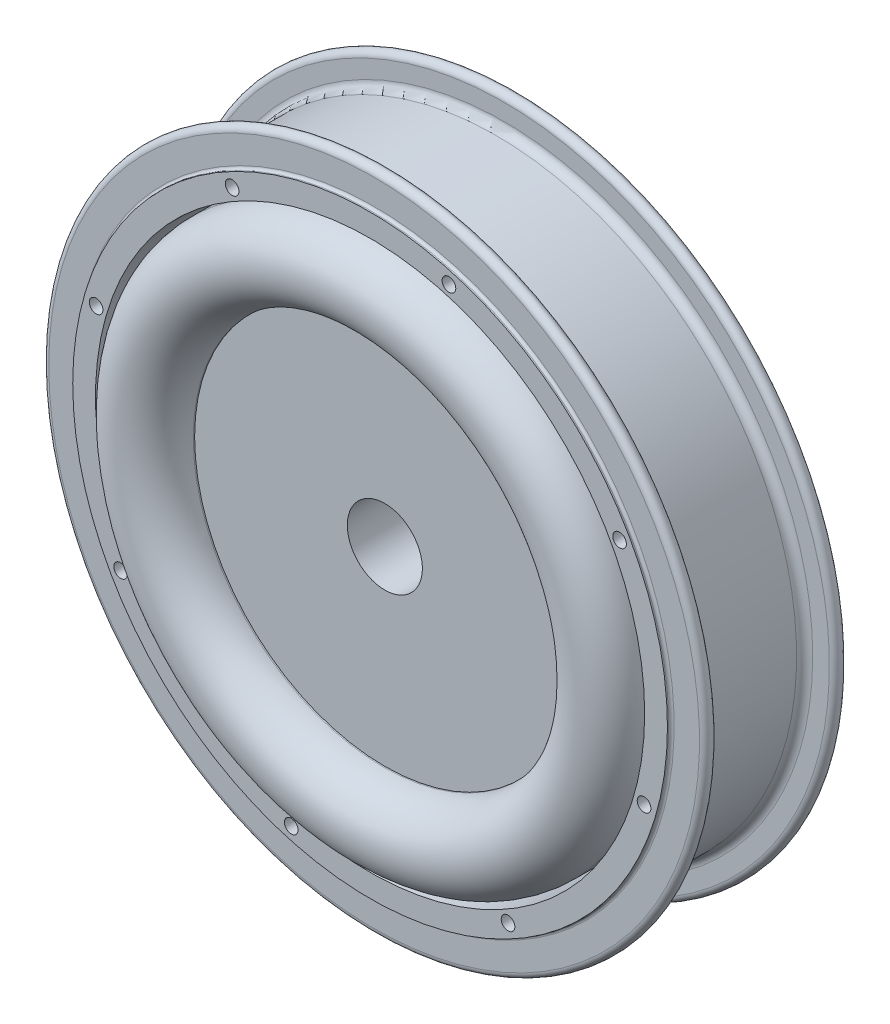
ISO-10303-21;
HEADER;
FILE_DESCRIPTION(('STEP AP214'),'2;1');
FILE_NAME('part.step','',(''),(''),'','','');
FILE_SCHEMA(('AUTOMOTIVE_DESIGN { 1 0 10303 214 1 1 1 1 }'));
ENDSEC;
DATA;
#1=APPLICATION_CONTEXT('core data for automotive mechanical design processes');
#2=APPLICATION_PROTOCOL_DEFINITION('international standard','automotive_design',2000,#1);
#3=PRODUCT_CONTEXT('',#1,'mechanical');
#4=PRODUCT('Part','Part','',(#3));
#5=PRODUCT_RELATED_PRODUCT_CATEGORY('part','',(#4));
#6=PRODUCT_DEFINITION_FORMATION('','',#4);
#7=PRODUCT_DEFINITION_CONTEXT('part definition',#1,'design');
#8=PRODUCT_DEFINITION('design','',#6,#7);
#9=PRODUCT_DEFINITION_SHAPE('','',#8);
#10=(LENGTH_UNIT() NAMED_UNIT(*) SI_UNIT(.MILLI.,.METRE.));
#11=(NAMED_UNIT(*) PLANE_ANGLE_UNIT() SI_UNIT($,.RADIAN.));
#12=(NAMED_UNIT(*) SI_UNIT($,.STERADIAN.) SOLID_ANGLE_UNIT());
#13=UNCERTAINTY_MEASURE_WITH_UNIT(LENGTH_MEASURE(1.E-05),#10,'distance_accuracy_value','');
#14=(GEOMETRIC_REPRESENTATION_CONTEXT(3) GLOBAL_UNCERTAINTY_ASSIGNED_CONTEXT((#13)) GLOBAL_UNIT_ASSIGNED_CONTEXT((#10,
#11,#12)) REPRESENTATION_CONTEXT('',''));
#15=CARTESIAN_POINT('',(0.,0.,0.));
#16=DIRECTION('',(0.,0.,1.));
#17=DIRECTION('',(1.,0.,0.));
#18=AXIS2_PLACEMENT_3D('',#15,#16,#17);
#19=CARTESIAN_POINT('',(0.,0.,28.));
#20=DIRECTION('',(0.,0.,1.));
#21=DIRECTION('',(1.,0.,0.));
#22=AXIS2_PLACEMENT_3D('',#19,#20,#21);
#23=CYLINDRICAL_SURFACE('',#22,71.);
#24=CARTESIAN_POINT('',(0.,0.,50.5));
#25=DIRECTION('',(0.,0.,-1.));
#26=DIRECTION('',(-1.,0.,0.));
#27=AXIS2_PLACEMENT_3D('',#24,#25,#26);
#28=CIRCLE('',#27,71.);
#29=CARTESIAN_POINT('',(-71.,0.,50.5));
#30=VERTEX_POINT('',#29);
#31=EDGE_CURVE('E63',#30,#30,#28,.T.);
#32=ORIENTED_EDGE('',*,*,#31,.T.);
#33=EDGE_LOOP('',(#32));
#34=FACE_BOUND('',#33,.T.);
#35=CARTESIAN_POINT('',(0.,0.,51.));
#36=DIRECTION('',(0.,0.,1.));
#37=DIRECTION('',(1.,0.,0.));
#38=AXIS2_PLACEMENT_3D('',#35,#36,#37);
#39=CIRCLE('',#38,71.);
#40=CARTESIAN_POINT('',(71.,0.,51.));
#41=VERTEX_POINT('',#40);
#42=EDGE_CURVE('E54',#41,#41,#39,.T.);
#43=ORIENTED_EDGE('',*,*,#42,.T.);
#44=EDGE_LOOP('',(#43));
#45=FACE_BOUND('',#44,.T.);
#46=ADVANCED_FACE('F43',(#34,#45),#23,.F.);
#47=CARTESIAN_POINT('',(0.,0.,5.00000000000001));
#48=DIRECTION('',(0.,0.,1.));
#49=DIRECTION('',(1.,0.,0.));
#50=AXIS2_PLACEMENT_3D('',#47,#48,#49);
#51=TOROIDAL_SURFACE('',#50,86.,15.);
#52=CARTESIAN_POINT('',(0.,0.,5.00000000000001));
#53=DIRECTION('',(0.,0.,1.));
#54=DIRECTION('',(1.,0.,0.));
#55=AXIS2_PLACEMENT_3D('',#52,#53,#54);
#56=CIRCLE('',#55,101.);
#57=CARTESIAN_POINT('',(101.,0.,5.00000000000001));
#58=VERTEX_POINT('',#57);
#59=EDGE_CURVE('E11',#58,#58,#56,.T.);
#60=ORIENTED_EDGE('',*,*,#59,.F.);
#61=EDGE_LOOP('',(#60));
#62=FACE_BOUND('',#61,.T.);
#63=CARTESIAN_POINT('',(0.,0.,5.00000000000001));
#64=DIRECTION('',(0.,0.,1.));
#65=DIRECTION('',(1.,0.,0.));
#66=AXIS2_PLACEMENT_3D('',#63,#64,#65);
#67=CIRCLE('',#66,71.);
#68=CARTESIAN_POINT('',(71.,0.,5.00000000000001));
#69=VERTEX_POINT('',#68);
#70=EDGE_CURVE('E58',#69,#69,#67,.T.);
#71=ORIENTED_EDGE('',*,*,#70,.T.);
#72=EDGE_LOOP('',(#71));
#73=FACE_BOUND('',#72,.T.);
#74=ADVANCED_FACE('F45',(#62,#73),#51,.T.);
#75=CARTESIAN_POINT('',(0.,0.,28.));
#76=DIRECTION('',(0.,0.,1.));
#77=DIRECTION('',(1.,0.,0.));
#78=AXIS2_PLACEMENT_3D('',#75,#76,#77);
#79=CYLINDRICAL_SURFACE('',#78,101.);
#80=CARTESIAN_POINT('',(0.,0.,51.));
#81=DIRECTION('',(0.,0.,1.));
#82=DIRECTION('',(1.,0.,0.));
#83=AXIS2_PLACEMENT_3D('',#80,#81,#82);
#84=CIRCLE('',#83,101.);
#85=CARTESIAN_POINT('',(101.,0.,51.));
#86=VERTEX_POINT('',#85);
#87=EDGE_CURVE('E50',#86,#86,#84,.T.);
#88=ORIENTED_EDGE('',*,*,#87,.F.);
#89=EDGE_LOOP('',(#88));
#90=FACE_BOUND('',#89,.T.);
#91=ORIENTED_EDGE('',*,*,#59,.T.);
#92=EDGE_LOOP('',(#91));
#93=FACE_BOUND('',#92,.T.);
#94=ADVANCED_FACE('F96',(#90,#93),#79,.T.);
#95=CARTESIAN_POINT('',(0.,0.,51.));
#96=DIRECTION('',(0.,0.,1.));
#97=DIRECTION('',(1.,0.,0.));
#98=AXIS2_PLACEMENT_3D('',#95,#96,#97);
#99=TOROIDAL_SURFACE('',#98,86.,15.);
#100=ORIENTED_EDGE('',*,*,#42,.F.);
#101=EDGE_LOOP('',(#100));
#102=FACE_BOUND('',#101,.T.);
#103=ORIENTED_EDGE('',*,*,#87,.T.);
#104=EDGE_LOOP('',(#103));
#105=FACE_BOUND('',#104,.T.);
#106=ADVANCED_FACE('F102',(#102,#105),#99,.T.);
#107=CARTESIAN_POINT('',(0.,0.,15.5));
#108=DIRECTION('',(0.,0.,-1.));
#109=DIRECTION('',(-1.,0.,0.));
#110=AXIS2_PLACEMENT_3D('',#107,#108,#109);
#111=CIRCLE('',#110,71.);
#112=CARTESIAN_POINT('',(-71.,0.,15.5));
#113=VERTEX_POINT('',#112);
#114=EDGE_CURVE('E66',#113,#113,#111,.T.);
#115=ORIENTED_EDGE('',*,*,#114,.F.);
#116=EDGE_LOOP('',(#115));
#117=FACE_BOUND('',#116,.T.);
#118=ORIENTED_EDGE('',*,*,#70,.F.);
#119=EDGE_LOOP('',(#118));
#120=FACE_BOUND('',#119,.T.);
#121=ADVANCED_FACE('F92',(#117,#120),#23,.F.);
#122=CARTESIAN_POINT('',(-14.,0.,50.5));
#123=DIRECTION('',(0.,0.,1.));
#124=DIRECTION('',(1.,0.,0.));
#125=AXIS2_PLACEMENT_3D('',#122,#123,#124);
#126=PLANE('',#125);
#127=CARTESIAN_POINT('',(0.,0.,50.5));
#128=DIRECTION('',(0.,0.,-1.));
#129=DIRECTION('',(-1.,0.,0.));
#130=AXIS2_PLACEMENT_3D('',#127,#128,#129);
#131=CIRCLE('',#130,14.);
#132=CARTESIAN_POINT('',(-14.,0.,50.5));
#133=VERTEX_POINT('',#132);
#134=EDGE_CURVE('E72',#133,#133,#131,.T.);
#135=ORIENTED_EDGE('',*,*,#134,.T.);
#136=EDGE_LOOP('',(#135));
#137=FACE_BOUND('',#136,.T.);
#138=ORIENTED_EDGE('',*,*,#31,.F.);
#139=EDGE_LOOP('',(#138));
#140=FACE_BOUND('',#139,.T.);
#141=ADVANCED_FACE('F76',(#137,#140),#126,.T.);
#142=CARTESIAN_POINT('',(-71.,0.,15.5));
#143=DIRECTION('',(0.,0.,-1.));
#144=DIRECTION('',(-1.,0.,0.));
#145=AXIS2_PLACEMENT_3D('',#142,#143,#144);
#146=PLANE('',#145);
#147=ORIENTED_EDGE('',*,*,#114,.T.);
#148=EDGE_LOOP('',(#147));
#149=FACE_BOUND('',#148,.T.);
#150=CARTESIAN_POINT('',(0.,0.,15.5));
#151=DIRECTION('',(0.,0.,-1.));
#152=DIRECTION('',(-1.,0.,0.));
#153=AXIS2_PLACEMENT_3D('',#150,#151,#152);
#154=CIRCLE('',#153,14.);
#155=CARTESIAN_POINT('',(-14.,0.,15.5));
#156=VERTEX_POINT('',#155);
#157=EDGE_CURVE('E69',#156,#156,#154,.T.);
#158=ORIENTED_EDGE('',*,*,#157,.F.);
#159=EDGE_LOOP('',(#158));
#160=FACE_BOUND('',#159,.T.);
#161=ADVANCED_FACE('F81',(#149,#160),#146,.T.);
#162=CARTESIAN_POINT('',(0.,0.,0.));
#163=DIRECTION('',(0.,0.,-1.));
#164=DIRECTION('',(-1.,0.,0.));
#165=AXIS2_PLACEMENT_3D('',#162,#163,#164);
#166=CYLINDRICAL_SURFACE('',#165,14.);
#167=ORIENTED_EDGE('',*,*,#157,.T.);
#168=EDGE_LOOP('',(#167));
#169=FACE_BOUND('',#168,.T.);
#170=ORIENTED_EDGE('',*,*,#134,.F.);
#171=EDGE_LOOP('',(#170));
#172=FACE_BOUND('',#171,.T.);
#173=ADVANCED_FACE('F79',(#169,#172),#166,.F.);
#174=CLOSED_SHELL('',(#46,#74,#94,#106,#121,#141,#161,#173));
#175=MANIFOLD_SOLID_BREP('B2',#174);
#176=CARTESIAN_POINT('',(0.,0.,56.));
#177=DIRECTION('',(0.,0.,-1.));
#178=DIRECTION('',(-1.,0.,0.));
#179=AXIS2_PLACEMENT_3D('',#176,#177,#178);
#180=CYLINDRICAL_SURFACE('',#179,111.);
#181=CARTESIAN_POINT('',(0.,0.,56.));
#182=DIRECTION('',(0.,0.,1.));
#183=DIRECTION('',(1.,0.,0.));
#184=AXIS2_PLACEMENT_3D('',#181,#182,#183);
#185=CIRCLE('',#184,111.);
#186=CARTESIAN_POINT('',(111.,0.,56.));
#187=VERTEX_POINT('',#186);
#188=EDGE_CURVE('E187',#187,#187,#185,.T.);
#189=ORIENTED_EDGE('',*,*,#188,.F.);
#190=EDGE_LOOP('',(#189));
#191=FACE_BOUND('',#190,.T.);
#192=CARTESIAN_POINT('',(0.,0.,55.5));
#193=DIRECTION('',(0.,0.,-1.));
#194=DIRECTION('',(-1.,0.,0.));
#195=AXIS2_PLACEMENT_3D('',#192,#193,#194);
#196=CIRCLE('',#195,111.);
#197=CARTESIAN_POINT('',(-111.,0.,55.5));
#198=VERTEX_POINT('',#197);
#199=EDGE_CURVE('E42',#198,#198,#196,.T.);
#200=ORIENTED_EDGE('',*,*,#199,.F.);
#201=EDGE_LOOP('',(#200));
#202=FACE_BOUND('',#201,.T.);
#203=ADVANCED_FACE('F180',(#191,#202),#180,.T.);
#204=CARTESIAN_POINT('',(0.,0.,56.));
#205=DIRECTION('',(0.,0.,1.));
#206=DIRECTION('',(1.,0.,0.));
#207=AXIS2_PLACEMENT_3D('',#204,#205,#206);
#208=PLANE('',#207);
#209=CARTESIAN_POINT('',(-51.4945917766846,93.1283518267935,56.));
#210=DIRECTION('',(0.,0.,1.));
#211=DIRECTION('',(0.707106781186556,0.707106781186539,0.));
#212=AXIS2_PLACEMENT_3D('',#209,#210,#211);
#213=CIRCLE('',#212,2.54473142682005);
#214=CARTESIAN_POINT('',(-49.6951949284816,94.9277486749965,56.));
#215=VERTEX_POINT('',#214);
#216=EDGE_CURVE('E220',#215,#215,#213,.T.);
#217=ORIENTED_EDGE('',*,*,#216,.F.);
#218=EDGE_LOOP('',(#217));
#219=FACE_BOUND('',#218,.T.);
#220=CARTESIAN_POINT('',(-102.263864137179,29.4395140577255,56.));
#221=DIRECTION('',(0.,0.,1.));
#222=DIRECTION('',(0.,1.,0.));
#223=AXIS2_PLACEMENT_3D('',#220,#221,#222);
#224=CIRCLE('',#223,2.54473142682005);
#225=CARTESIAN_POINT('',(-102.263864137179,31.9842454845455,56.));
#226=VERTEX_POINT('',#225);
#227=EDGE_CURVE('E219',#226,#226,#224,.T.);
#228=ORIENTED_EDGE('',*,*,#227,.F.);
#229=EDGE_LOOP('',(#228));
#230=FACE_BOUND('',#229,.T.);
#231=CARTESIAN_POINT('',(-93.1283518267933,-51.4945917766849,56.));
#232=DIRECTION('',(0.,0.,1.));
#233=DIRECTION('',(-0.707106781186541,0.707106781186554,0.));
#234=AXIS2_PLACEMENT_3D('',#231,#232,#233);
#235=CIRCLE('',#234,2.54473142682005);
#236=CARTESIAN_POINT('',(-94.9277486749963,-49.6951949284819,56.));
#237=VERTEX_POINT('',#236);
#238=EDGE_CURVE('E227',#237,#237,#235,.T.);
#239=ORIENTED_EDGE('',*,*,#238,.F.);
#240=EDGE_LOOP('',(#239));
#241=FACE_BOUND('',#240,.T.);
#242=CARTESIAN_POINT('',(-29.4395140577244,-102.263864137179,56.));
#243=DIRECTION('',(0.,0.,1.));
#244=DIRECTION('',(-1.,0.,0.));
#245=AXIS2_PLACEMENT_3D('',#242,#243,#244);
#246=CIRCLE('',#245,2.54473142682005);
#247=CARTESIAN_POINT('',(-31.9842454845444,-102.263864137179,56.));
#248=VERTEX_POINT('',#247);
#249=EDGE_CURVE('E233',#248,#248,#246,.T.);
#250=ORIENTED_EDGE('',*,*,#249,.F.);
#251=EDGE_LOOP('',(#250));
#252=FACE_BOUND('',#251,.T.);
#253=CARTESIAN_POINT('',(51.4945917766852,-93.1283518267932,56.));
#254=DIRECTION('',(0.,0.,1.));
#255=DIRECTION('',(-0.707106781186551,-0.707106781186544,0.));
#256=AXIS2_PLACEMENT_3D('',#253,#254,#255);
#257=CIRCLE('',#256,2.54473142682005);
#258=CARTESIAN_POINT('',(49.6951949284822,-94.9277486749962,56.));
#259=VERTEX_POINT('',#258);
#260=EDGE_CURVE('E239',#259,#259,#257,.T.);
#261=ORIENTED_EDGE('',*,*,#260,.F.);
#262=EDGE_LOOP('',(#261));
#263=FACE_BOUND('',#262,.T.);
#264=CARTESIAN_POINT('',(102.263864137179,-29.4395140577247,56.));
#265=DIRECTION('',(0.,0.,1.));
#266=DIRECTION('',(0.,-1.,0.));
#267=AXIS2_PLACEMENT_3D('',#264,#265,#266);
#268=CIRCLE('',#267,2.54473142682005);
#269=CARTESIAN_POINT('',(102.263864137179,-31.9842454845448,56.));
#270=VERTEX_POINT('',#269);
#271=EDGE_CURVE('E245',#270,#270,#268,.T.);
#272=ORIENTED_EDGE('',*,*,#271,.F.);
#273=EDGE_LOOP('',(#272));
#274=FACE_BOUND('',#273,.T.);
#275=CARTESIAN_POINT('',(93.128351826793,51.4945917766855,56.));
#276=DIRECTION('',(0.,0.,1.));
#277=DIRECTION('',(0.707106781186546,-0.707106781186549,0.));
#278=AXIS2_PLACEMENT_3D('',#275,#276,#277);
#279=CIRCLE('',#278,2.54473142682005);
#280=CARTESIAN_POINT('',(94.927748674996,49.6951949284826,56.));
#281=VERTEX_POINT('',#280);
#282=EDGE_CURVE('E212',#281,#281,#279,.T.);
#283=ORIENTED_EDGE('',*,*,#282,.F.);
#284=EDGE_LOOP('',(#283));
#285=FACE_BOUND('',#284,.T.);
#286=CARTESIAN_POINT('',(29.4395140577244,102.263864137179,56.));
#287=DIRECTION('',(0.,0.,1.));
#288=DIRECTION('',(1.,0.,0.));
#289=AXIS2_PLACEMENT_3D('',#286,#287,#288);
#290=CIRCLE('',#289,2.54473142682005);
#291=CARTESIAN_POINT('',(31.9842454845444,102.263864137179,56.));
#292=VERTEX_POINT('',#291);
#293=EDGE_CURVE('E204',#292,#292,#290,.T.);
#294=ORIENTED_EDGE('',*,*,#293,.F.);
#295=EDGE_LOOP('',(#294));
#296=FACE_BOUND('',#295,.T.);
#297=CARTESIAN_POINT('',(0.,0.,56.));
#298=DIRECTION('',(0.,0.,1.));
#299=DIRECTION('',(1.,0.,0.));
#300=AXIS2_PLACEMENT_3D('',#297,#298,#299);
#301=CIRCLE('',#300,102.5);
#302=CARTESIAN_POINT('',(102.5,0.,56.));
#303=VERTEX_POINT('',#302);
#304=EDGE_CURVE('E196',#303,#303,#301,.T.);
#305=ORIENTED_EDGE('',*,*,#304,.F.);
#306=EDGE_LOOP('',(#305));
#307=FACE_BOUND('',#306,.T.);
#308=ORIENTED_EDGE('',*,*,#188,.T.);
#309=EDGE_LOOP('',(#308));
#310=FACE_BOUND('',#309,.T.);
#311=ADVANCED_FACE('F299',(#219,#230,#241,#252,#263,#274,#285,#296,#307,#310),#208,.T.);
#312=CARTESIAN_POINT('',(0.,0.,0.));
#313=DIRECTION('',(0.,0.,1.));
#314=DIRECTION('',(1.,0.,0.));
#315=AXIS2_PLACEMENT_3D('',#312,#313,#314);
#316=PLANE('',#315);
#317=CARTESIAN_POINT('',(0.,0.,0.));
#318=DIRECTION('',(0.,0.,1.));
#319=DIRECTION('',(1.,0.,0.));
#320=AXIS2_PLACEMENT_3D('',#317,#318,#319);
#321=CIRCLE('',#320,111.);
#322=CARTESIAN_POINT('',(111.,0.,0.));
#323=VERTEX_POINT('',#322);
#324=EDGE_CURVE('E191',#323,#323,#321,.T.);
#325=ORIENTED_EDGE('',*,*,#324,.F.);
#326=EDGE_LOOP('',(#325));
#327=FACE_BOUND('',#326,.T.);
#328=CARTESIAN_POINT('',(0.,0.,0.));
#329=DIRECTION('',(0.,0.,1.));
#330=DIRECTION('',(1.,0.,0.));
#331=AXIS2_PLACEMENT_3D('',#328,#329,#330);
#332=CIRCLE('',#331,102.5);
#333=CARTESIAN_POINT('',(102.5,0.,0.));
#334=VERTEX_POINT('',#333);
#335=EDGE_CURVE('E198',#334,#334,#332,.T.);
#336=ORIENTED_EDGE('',*,*,#335,.T.);
#337=EDGE_LOOP('',(#336));
#338=FACE_BOUND('',#337,.T.);
#339=ADVANCED_FACE('F304',(#327,#338),#316,.F.);
#340=CARTESIAN_POINT('',(0.,0.,0.499999999999994));
#341=DIRECTION('',(0.,0.,-1.));
#342=DIRECTION('',(-1.,0.,0.));
#343=AXIS2_PLACEMENT_3D('',#340,#341,#342);
#344=CIRCLE('',#343,111.);
#345=CARTESIAN_POINT('',(-111.,0.,0.499999999999994));
#346=VERTEX_POINT('',#345);
#347=EDGE_CURVE('E275',#346,#346,#344,.T.);
#348=ORIENTED_EDGE('',*,*,#347,.T.);
#349=EDGE_LOOP('',(#348));
#350=FACE_BOUND('',#349,.T.);
#351=ORIENTED_EDGE('',*,*,#324,.T.);
#352=EDGE_LOOP('',(#351));
#353=FACE_BOUND('',#352,.T.);
#354=ADVANCED_FACE('F182',(#350,#353),#180,.T.);
#355=CARTESIAN_POINT('',(0.,0.,56.));
#356=DIRECTION('',(0.,0.,-1.));
#357=DIRECTION('',(-1.,0.,0.));
#358=AXIS2_PLACEMENT_3D('',#355,#356,#357);
#359=CYLINDRICAL_SURFACE('',#358,102.5);
#360=ORIENTED_EDGE('',*,*,#304,.T.);
#361=EDGE_LOOP('',(#360));
#362=FACE_BOUND('',#361,.T.);
#363=ORIENTED_EDGE('',*,*,#335,.F.);
#364=EDGE_LOOP('',(#363));
#365=FACE_BOUND('',#364,.T.);
#366=ADVANCED_FACE('F309',(#362,#365),#359,.F.);
#367=CARTESIAN_POINT('',(29.4395140577244,102.263864137179,41.));
#368=DIRECTION('',(0.,0.,1.));
#369=DIRECTION('',(1.,0.,0.));
#370=AXIS2_PLACEMENT_3D('',#367,#368,#369);
#371=CYLINDRICAL_SURFACE('',#370,2.54473142682005);
#372=CARTESIAN_POINT('',(29.4395140577244,102.263864137179,41.));
#373=DIRECTION('',(0.,0.,1.));
#374=DIRECTION('',(1.,0.,0.));
#375=AXIS2_PLACEMENT_3D('',#372,#373,#374);
#376=CIRCLE('',#375,2.54473142682005);
#377=CARTESIAN_POINT('',(31.9842454845444,102.263864137179,41.));
#378=VERTEX_POINT('',#377);
#379=EDGE_CURVE('E201',#378,#378,#376,.T.);
#380=ORIENTED_EDGE('',*,*,#379,.F.);
#381=EDGE_LOOP('',(#380));
#382=FACE_BOUND('',#381,.T.);
#383=ORIENTED_EDGE('',*,*,#293,.T.);
#384=EDGE_LOOP('',(#383));
#385=FACE_BOUND('',#384,.T.);
#386=ADVANCED_FACE('F315',(#382,#385),#371,.F.);
#387=CARTESIAN_POINT('',(29.4395140577244,102.263864137179,41.));
#388=DIRECTION('',(0.,0.,1.));
#389=DIRECTION('',(1.,0.,0.));
#390=AXIS2_PLACEMENT_3D('',#387,#388,#389);
#391=PLANE('',#390);
#392=ORIENTED_EDGE('',*,*,#379,.T.);
#393=EDGE_LOOP('',(#392));
#394=FACE_BOUND('',#393,.T.);
#395=ADVANCED_FACE('F417',(#394),#391,.T.);
#396=CARTESIAN_POINT('',(93.128351826793,51.4945917766855,41.));
#397=DIRECTION('',(0.,0.,1.));
#398=DIRECTION('',(0.707106781186546,-0.707106781186549,0.));
#399=AXIS2_PLACEMENT_3D('',#396,#397,#398);
#400=CYLINDRICAL_SURFACE('',#399,2.54473142682005);
#401=CARTESIAN_POINT('',(93.128351826793,51.4945917766855,41.));
#402=DIRECTION('',(0.,0.,1.));
#403=DIRECTION('',(0.707106781186546,-0.707106781186549,0.));
#404=AXIS2_PLACEMENT_3D('',#401,#402,#403);
#405=CIRCLE('',#404,2.54473142682005);
#406=CARTESIAN_POINT('',(94.927748674996,49.6951949284826,41.));
#407=VERTEX_POINT('',#406);
#408=EDGE_CURVE('E207',#407,#407,#405,.T.);
#409=ORIENTED_EDGE('',*,*,#408,.F.);
#410=EDGE_LOOP('',(#409));
#411=FACE_BOUND('',#410,.T.);
#412=ORIENTED_EDGE('',*,*,#282,.T.);
#413=EDGE_LOOP('',(#412));
#414=FACE_BOUND('',#413,.T.);
#415=ADVANCED_FACE('F413',(#411,#414),#400,.F.);
#416=CARTESIAN_POINT('',(93.128351826793,51.4945917766855,41.));
#417=DIRECTION('',(0.,0.,1.));
#418=DIRECTION('',(0.707106781186546,-0.707106781186549,0.));
#419=AXIS2_PLACEMENT_3D('',#416,#417,#418);
#420=PLANE('',#419);
#421=ORIENTED_EDGE('',*,*,#408,.T.);
#422=EDGE_LOOP('',(#421));
#423=FACE_BOUND('',#422,.T.);
#424=ADVANCED_FACE('F371',(#423),#420,.T.);
#425=CARTESIAN_POINT('',(102.263864137179,-29.4395140577247,41.));
#426=DIRECTION('',(0.,0.,1.));
#427=DIRECTION('',(0.,-1.,0.));
#428=AXIS2_PLACEMENT_3D('',#425,#426,#427);
#429=CYLINDRICAL_SURFACE('',#428,2.54473142682005);
#430=CARTESIAN_POINT('',(102.263864137179,-29.4395140577247,41.));
#431=DIRECTION('',(0.,0.,1.));
#432=DIRECTION('',(0.,-1.,0.));
#433=AXIS2_PLACEMENT_3D('',#430,#431,#432);
#434=CIRCLE('',#433,2.54473142682005);
#435=CARTESIAN_POINT('',(102.263864137179,-31.9842454845448,41.));
#436=VERTEX_POINT('',#435);
#437=EDGE_CURVE('E215',#436,#436,#434,.T.);
#438=ORIENTED_EDGE('',*,*,#437,.F.);
#439=EDGE_LOOP('',(#438));
#440=FACE_BOUND('',#439,.T.);
#441=ORIENTED_EDGE('',*,*,#271,.T.);
#442=EDGE_LOOP('',(#441));
#443=FACE_BOUND('',#442,.T.);
#444=ADVANCED_FACE('F367',(#440,#443),#429,.F.);
#445=CARTESIAN_POINT('',(102.263864137179,-29.4395140577247,41.));
#446=DIRECTION('',(0.,0.,1.));
#447=DIRECTION('',(0.,-1.,0.));
#448=AXIS2_PLACEMENT_3D('',#445,#446,#447);
#449=PLANE('',#448);
#450=ORIENTED_EDGE('',*,*,#437,.T.);
#451=EDGE_LOOP('',(#450));
#452=FACE_BOUND('',#451,.T.);
#453=ADVANCED_FACE('F363',(#452),#449,.T.);
#454=CARTESIAN_POINT('',(51.4945917766852,-93.1283518267932,41.));
#455=DIRECTION('',(0.,0.,1.));
#456=DIRECTION('',(-0.707106781186551,-0.707106781186544,0.));
#457=AXIS2_PLACEMENT_3D('',#454,#455,#456);
#458=CYLINDRICAL_SURFACE('',#457,2.54473142682005);
#459=CARTESIAN_POINT('',(51.4945917766852,-93.1283518267932,41.));
#460=DIRECTION('',(0.,0.,1.));
#461=DIRECTION('',(-0.707106781186551,-0.707106781186544,0.));
#462=AXIS2_PLACEMENT_3D('',#459,#460,#461);
#463=CIRCLE('',#462,2.54473142682005);
#464=CARTESIAN_POINT('',(49.6951949284822,-94.9277486749962,41.));
#465=VERTEX_POINT('',#464);
#466=EDGE_CURVE('E242',#465,#465,#463,.T.);
#467=ORIENTED_EDGE('',*,*,#466,.F.);
#468=EDGE_LOOP('',(#467));
#469=FACE_BOUND('',#468,.T.);
#470=ORIENTED_EDGE('',*,*,#260,.T.);
#471=EDGE_LOOP('',(#470));
#472=FACE_BOUND('',#471,.T.);
#473=ADVANCED_FACE('F366',(#469,#472),#458,.F.);
#474=CARTESIAN_POINT('',(51.4945917766852,-93.1283518267932,41.));
#475=DIRECTION('',(0.,0.,1.));
#476=DIRECTION('',(-0.707106781186551,-0.707106781186544,0.));
#477=AXIS2_PLACEMENT_3D('',#474,#475,#476);
#478=PLANE('',#477);
#479=ORIENTED_EDGE('',*,*,#466,.T.);
#480=EDGE_LOOP('',(#479));
#481=FACE_BOUND('',#480,.T.);
#482=ADVANCED_FACE('F373',(#481),#478,.T.);
#483=CARTESIAN_POINT('',(-29.4395140577244,-102.263864137179,41.));
#484=DIRECTION('',(0.,0.,1.));
#485=DIRECTION('',(-1.,0.,0.));
#486=AXIS2_PLACEMENT_3D('',#483,#484,#485);
#487=CYLINDRICAL_SURFACE('',#486,2.54473142682005);
#488=CARTESIAN_POINT('',(-29.4395140577244,-102.263864137179,41.));
#489=DIRECTION('',(0.,0.,1.));
#490=DIRECTION('',(-1.,0.,0.));
#491=AXIS2_PLACEMENT_3D('',#488,#489,#490);
#492=CIRCLE('',#491,2.54473142682005);
#493=CARTESIAN_POINT('',(-31.9842454845444,-102.263864137179,41.));
#494=VERTEX_POINT('',#493);
#495=EDGE_CURVE('E236',#494,#494,#492,.T.);
#496=ORIENTED_EDGE('',*,*,#495,.F.);
#497=EDGE_LOOP('',(#496));
#498=FACE_BOUND('',#497,.T.);
#499=ORIENTED_EDGE('',*,*,#249,.T.);
#500=EDGE_LOOP('',(#499));
#501=FACE_BOUND('',#500,.T.);
#502=ADVANCED_FACE('F376',(#498,#501),#487,.F.);
#503=CARTESIAN_POINT('',(-29.4395140577244,-102.263864137179,41.));
#504=DIRECTION('',(0.,0.,1.));
#505=DIRECTION('',(-1.,0.,0.));
#506=AXIS2_PLACEMENT_3D('',#503,#504,#505);
#507=PLANE('',#506);
#508=ORIENTED_EDGE('',*,*,#495,.T.);
#509=EDGE_LOOP('',(#508));
#510=FACE_BOUND('',#509,.T.);
#511=ADVANCED_FACE('F381',(#510),#507,.T.);
#512=CARTESIAN_POINT('',(-93.1283518267933,-51.4945917766849,41.));
#513=DIRECTION('',(0.,0.,1.));
#514=DIRECTION('',(-0.707106781186541,0.707106781186554,0.));
#515=AXIS2_PLACEMENT_3D('',#512,#513,#514);
#516=CYLINDRICAL_SURFACE('',#515,2.54473142682005);
#517=CARTESIAN_POINT('',(-93.1283518267933,-51.4945917766849,41.));
#518=DIRECTION('',(0.,0.,1.));
#519=DIRECTION('',(-0.707106781186541,0.707106781186554,0.));
#520=AXIS2_PLACEMENT_3D('',#517,#518,#519);
#521=CIRCLE('',#520,2.54473142682005);
#522=CARTESIAN_POINT('',(-94.9277486749963,-49.6951949284819,41.));
#523=VERTEX_POINT('',#522);
#524=EDGE_CURVE('E230',#523,#523,#521,.T.);
#525=ORIENTED_EDGE('',*,*,#524,.F.);
#526=EDGE_LOOP('',(#525));
#527=FACE_BOUND('',#526,.T.);
#528=ORIENTED_EDGE('',*,*,#238,.T.);
#529=EDGE_LOOP('',(#528));
#530=FACE_BOUND('',#529,.T.);
#531=ADVANCED_FACE('F384',(#527,#530),#516,.F.);
#532=CARTESIAN_POINT('',(-93.1283518267933,-51.4945917766849,41.));
#533=DIRECTION('',(0.,0.,1.));
#534=DIRECTION('',(-0.707106781186541,0.707106781186554,0.));
#535=AXIS2_PLACEMENT_3D('',#532,#533,#534);
#536=PLANE('',#535);
#537=ORIENTED_EDGE('',*,*,#524,.T.);
#538=EDGE_LOOP('',(#537));
#539=FACE_BOUND('',#538,.T.);
#540=ADVANCED_FACE('F389',(#539),#536,.T.);
#541=CARTESIAN_POINT('',(-102.263864137179,29.4395140577255,41.));
#542=DIRECTION('',(0.,0.,1.));
#543=DIRECTION('',(0.,1.,0.));
#544=AXIS2_PLACEMENT_3D('',#541,#542,#543);
#545=CYLINDRICAL_SURFACE('',#544,2.54473142682005);
#546=CARTESIAN_POINT('',(-102.263864137179,29.4395140577255,41.));
#547=DIRECTION('',(0.,0.,1.));
#548=DIRECTION('',(0.,1.,0.));
#549=AXIS2_PLACEMENT_3D('',#546,#547,#548);
#550=CIRCLE('',#549,2.54473142682005);
#551=CARTESIAN_POINT('',(-102.263864137179,31.9842454845455,41.));
#552=VERTEX_POINT('',#551);
#553=EDGE_CURVE('E224',#552,#552,#550,.T.);
#554=ORIENTED_EDGE('',*,*,#553,.F.);
#555=EDGE_LOOP('',(#554));
#556=FACE_BOUND('',#555,.T.);
#557=ORIENTED_EDGE('',*,*,#227,.T.);
#558=EDGE_LOOP('',(#557));
#559=FACE_BOUND('',#558,.T.);
#560=ADVANCED_FACE('F392',(#556,#559),#545,.F.);
#561=CARTESIAN_POINT('',(-102.263864137179,29.4395140577255,41.));
#562=DIRECTION('',(0.,0.,1.));
#563=DIRECTION('',(0.,1.,0.));
#564=AXIS2_PLACEMENT_3D('',#561,#562,#563);
#565=PLANE('',#564);
#566=ORIENTED_EDGE('',*,*,#553,.T.);
#567=EDGE_LOOP('',(#566));
#568=FACE_BOUND('',#567,.T.);
#569=ADVANCED_FACE('F397',(#568),#565,.T.);
#570=CARTESIAN_POINT('',(-51.4945917766846,93.1283518267935,41.));
#571=DIRECTION('',(0.,0.,1.));
#572=DIRECTION('',(0.707106781186556,0.707106781186539,0.));
#573=AXIS2_PLACEMENT_3D('',#570,#571,#572);
#574=CYLINDRICAL_SURFACE('',#573,2.54473142682005);
#575=CARTESIAN_POINT('',(-51.4945917766846,93.1283518267935,41.));
#576=DIRECTION('',(0.,0.,1.));
#577=DIRECTION('',(0.707106781186556,0.707106781186539,0.));
#578=AXIS2_PLACEMENT_3D('',#575,#576,#577);
#579=CIRCLE('',#578,2.54473142682005);
#580=CARTESIAN_POINT('',(-49.6951949284816,94.9277486749965,41.));
#581=VERTEX_POINT('',#580);
#582=EDGE_CURVE('E216',#581,#581,#579,.T.);
#583=ORIENTED_EDGE('',*,*,#582,.F.);
#584=EDGE_LOOP('',(#583));
#585=FACE_BOUND('',#584,.T.);
#586=ORIENTED_EDGE('',*,*,#216,.T.);
#587=EDGE_LOOP('',(#586));
#588=FACE_BOUND('',#587,.T.);
#589=ADVANCED_FACE('F400',(#585,#588),#574,.F.);
#590=CARTESIAN_POINT('',(-51.4945917766846,93.1283518267935,41.));
#591=DIRECTION('',(0.,0.,1.));
#592=DIRECTION('',(0.707106781186556,0.707106781186539,0.));
#593=AXIS2_PLACEMENT_3D('',#590,#591,#592);
#594=PLANE('',#593);
#595=ORIENTED_EDGE('',*,*,#582,.T.);
#596=EDGE_LOOP('',(#595));
#597=FACE_BOUND('',#596,.T.);
#598=ADVANCED_FACE('F362',(#597),#594,.T.);
#599=CARTESIAN_POINT('',(0.,0.,52.25));
#600=DIRECTION('',(0.,0.,-1.));
#601=DIRECTION('',(-1.,0.,0.));
#602=AXIS2_PLACEMENT_3D('',#599,#600,#601);
#603=TOROIDAL_SURFACE('',#602,121.45,2.25);
#604=CARTESIAN_POINT('',(0.,0.,54.5));
#605=DIRECTION('',(0.,0.,-1.));
#606=DIRECTION('',(-1.,0.,0.));
#607=AXIS2_PLACEMENT_3D('',#604,#605,#606);
#608=CIRCLE('',#607,121.45);
#609=CARTESIAN_POINT('',(-121.45,0.,54.5));
#610=VERTEX_POINT('',#609);
#611=EDGE_CURVE('E281',#610,#610,#608,.T.);
#612=ORIENTED_EDGE('',*,*,#611,.T.);
#613=EDGE_LOOP('',(#612));
#614=FACE_BOUND('',#613,.T.);
#615=CARTESIAN_POINT('',(0.,0.,50.));
#616=DIRECTION('',(0.,0.,-1.));
#617=DIRECTION('',(-1.,0.,0.));
#618=AXIS2_PLACEMENT_3D('',#615,#616,#617);
#619=CIRCLE('',#618,121.45);
#620=CARTESIAN_POINT('',(-121.45,0.,50.));
#621=VERTEX_POINT('',#620);
#622=EDGE_CURVE('E223',#621,#621,#619,.T.);
#623=ORIENTED_EDGE('',*,*,#622,.F.);
#624=EDGE_LOOP('',(#623));
#625=FACE_BOUND('',#624,.T.);
#626=ADVANCED_FACE('F285',(#614,#625),#603,.T.);
#627=CARTESIAN_POINT('',(0.,121.45,50.));
#628=DIRECTION('',(0.,0.,-1.));
#629=DIRECTION('',(-1.,0.,0.));
#630=AXIS2_PLACEMENT_3D('',#627,#628,#629);
#631=PLANE('',#630);
#632=ORIENTED_EDGE('',*,*,#622,.T.);
#633=EDGE_LOOP('',(#632));
#634=FACE_BOUND('',#633,.T.);
#635=CARTESIAN_POINT('',(0.,0.,50.));
#636=DIRECTION('',(0.,0.,-1.));
#637=DIRECTION('',(-1.,0.,0.));
#638=AXIS2_PLACEMENT_3D('',#635,#636,#637);
#639=CIRCLE('',#638,115.228396921285);
#640=CARTESIAN_POINT('',(-115.228396921285,0.,50.));
#641=VERTEX_POINT('',#640);
#642=EDGE_CURVE('E254',#641,#641,#639,.T.);
#643=ORIENTED_EDGE('',*,*,#642,.F.);
#644=EDGE_LOOP('',(#643));
#645=FACE_BOUND('',#644,.T.);
#646=ADVANCED_FACE('F355',(#634,#645),#631,.T.);
#647=CARTESIAN_POINT('',(0.,0.,47.));
#648=DIRECTION('',(0.,0.,-1.));
#649=DIRECTION('',(-1.,0.,0.));
#650=AXIS2_PLACEMENT_3D('',#647,#648,#649);
#651=TOROIDAL_SURFACE('',#650,115.228396921285,3.);
#652=ORIENTED_EDGE('',*,*,#642,.T.);
#653=EDGE_LOOP('',(#652));
#654=FACE_BOUND('',#653,.T.);
#655=CARTESIAN_POINT('',(0.,0.,47.));
#656=DIRECTION('',(0.,0.,-1.));
#657=DIRECTION('',(-1.,0.,0.));
#658=AXIS2_PLACEMENT_3D('',#655,#656,#657);
#659=CIRCLE('',#658,112.228396921285);
#660=CARTESIAN_POINT('',(-112.228396921285,0.,47.));
#661=VERTEX_POINT('',#660);
#662=EDGE_CURVE('E257',#661,#661,#659,.T.);
#663=ORIENTED_EDGE('',*,*,#662,.F.);
#664=EDGE_LOOP('',(#663));
#665=FACE_BOUND('',#664,.T.);
#666=ADVANCED_FACE('F351',(#654,#665),#651,.F.);
#667=CARTESIAN_POINT('',(0.,0.,0.));
#668=DIRECTION('',(0.,0.,-1.));
#669=DIRECTION('',(-1.,0.,0.));
#670=AXIS2_PLACEMENT_3D('',#667,#668,#669);
#671=CYLINDRICAL_SURFACE('',#670,112.228396921285);
#672=ORIENTED_EDGE('',*,*,#662,.T.);
#673=EDGE_LOOP('',(#672));
#674=FACE_BOUND('',#673,.T.);
#675=CARTESIAN_POINT('',(0.,0.,9.00000000000001));
#676=DIRECTION('',(0.,0.,-1.));
#677=DIRECTION('',(-1.,0.,0.));
#678=AXIS2_PLACEMENT_3D('',#675,#676,#677);
#679=CIRCLE('',#678,112.228396921285);
#680=CARTESIAN_POINT('',(-112.228396921285,0.,9.00000000000001));
#681=VERTEX_POINT('',#680);
#682=EDGE_CURVE('E260',#681,#681,#679,.T.);
#683=ORIENTED_EDGE('',*,*,#682,.F.);
#684=EDGE_LOOP('',(#683));
#685=FACE_BOUND('',#684,.T.);
#686=ADVANCED_FACE('F347',(#674,#685),#671,.T.);
#687=CARTESIAN_POINT('',(0.,0.,8.99999999999999));
#688=DIRECTION('',(0.,0.,-1.));
#689=DIRECTION('',(-1.,0.,0.));
#690=AXIS2_PLACEMENT_3D('',#687,#688,#689);
#691=TOROIDAL_SURFACE('',#690,115.228396921285,3.);
#692=ORIENTED_EDGE('',*,*,#682,.T.);
#693=EDGE_LOOP('',(#692));
#694=FACE_BOUND('',#693,.T.);
#695=CARTESIAN_POINT('',(0.,0.,6.));
#696=DIRECTION('',(0.,0.,-1.));
#697=DIRECTION('',(-1.,0.,0.));
#698=AXIS2_PLACEMENT_3D('',#695,#696,#697);
#699=CIRCLE('',#698,115.228396921285);
#700=CARTESIAN_POINT('',(-115.228396921285,0.,6.));
#701=VERTEX_POINT('',#700);
#702=EDGE_CURVE('E263',#701,#701,#699,.T.);
#703=ORIENTED_EDGE('',*,*,#702,.F.);
#704=EDGE_LOOP('',(#703));
#705=FACE_BOUND('',#704,.T.);
#706=ADVANCED_FACE('F343',(#694,#705),#691,.F.);
#707=CARTESIAN_POINT('',(0.,121.45,5.99999999999999));
#708=DIRECTION('',(0.,0.,1.));
#709=DIRECTION('',(1.,0.,0.));
#710=AXIS2_PLACEMENT_3D('',#707,#708,#709);
#711=PLANE('',#710);
#712=ORIENTED_EDGE('',*,*,#702,.T.);
#713=EDGE_LOOP('',(#712));
#714=FACE_BOUND('',#713,.T.);
#715=CARTESIAN_POINT('',(0.,0.,5.99999999999999));
#716=DIRECTION('',(0.,0.,-1.));
#717=DIRECTION('',(-1.,0.,0.));
#718=AXIS2_PLACEMENT_3D('',#715,#716,#717);
#719=CIRCLE('',#718,121.45);
#720=CARTESIAN_POINT('',(-121.45,0.,5.99999999999999));
#721=VERTEX_POINT('',#720);
#722=EDGE_CURVE('E266',#721,#721,#719,.T.);
#723=ORIENTED_EDGE('',*,*,#722,.F.);
#724=EDGE_LOOP('',(#723));
#725=FACE_BOUND('',#724,.T.);
#726=ADVANCED_FACE('F339',(#714,#725),#711,.T.);
#727=CARTESIAN_POINT('',(0.,0.,3.75));
#728=DIRECTION('',(0.,0.,-1.));
#729=DIRECTION('',(-1.,0.,0.));
#730=AXIS2_PLACEMENT_3D('',#727,#728,#729);
#731=TOROIDAL_SURFACE('',#730,121.45,2.25);
#732=ORIENTED_EDGE('',*,*,#722,.T.);
#733=EDGE_LOOP('',(#732));
#734=FACE_BOUND('',#733,.T.);
#735=CARTESIAN_POINT('',(0.,0.,1.5));
#736=DIRECTION('',(0.,0.,-1.));
#737=DIRECTION('',(-1.,0.,0.));
#738=AXIS2_PLACEMENT_3D('',#735,#736,#737);
#739=CIRCLE('',#738,121.45);
#740=CARTESIAN_POINT('',(-121.45,0.,1.5));
#741=VERTEX_POINT('',#740);
#742=EDGE_CURVE('E269',#741,#741,#739,.T.);
#743=ORIENTED_EDGE('',*,*,#742,.F.);
#744=EDGE_LOOP('',(#743));
#745=FACE_BOUND('',#744,.T.);
#746=ADVANCED_FACE('F333',(#734,#745),#731,.T.);
#747=CARTESIAN_POINT('',(0.,112.,1.5));
#748=DIRECTION('',(0.,0.,-1.));
#749=DIRECTION('',(-1.,0.,0.));
#750=AXIS2_PLACEMENT_3D('',#747,#748,#749);
#751=PLANE('',#750);
#752=ORIENTED_EDGE('',*,*,#742,.T.);
#753=EDGE_LOOP('',(#752));
#754=FACE_BOUND('',#753,.T.);
#755=CARTESIAN_POINT('',(0.,0.,1.5));
#756=DIRECTION('',(0.,0.,-1.));
#757=DIRECTION('',(-1.,0.,0.));
#758=AXIS2_PLACEMENT_3D('',#755,#756,#757);
#759=CIRCLE('',#758,112.);
#760=CARTESIAN_POINT('',(-112.,0.,1.5));
#761=VERTEX_POINT('',#760);
#762=EDGE_CURVE('E272',#761,#761,#759,.T.);
#763=ORIENTED_EDGE('',*,*,#762,.F.);
#764=EDGE_LOOP('',(#763));
#765=FACE_BOUND('',#764,.T.);
#766=ADVANCED_FACE('F327',(#754,#765),#751,.T.);
#767=CARTESIAN_POINT('',(0.,0.,0.5));
#768=DIRECTION('',(0.,0.,-1.));
#769=DIRECTION('',(-1.,0.,0.));
#770=AXIS2_PLACEMENT_3D('',#767,#768,#769);
#771=TOROIDAL_SURFACE('',#770,112.,1.);
#772=ORIENTED_EDGE('',*,*,#762,.T.);
#773=EDGE_LOOP('',(#772));
#774=FACE_BOUND('',#773,.T.);
#775=ORIENTED_EDGE('',*,*,#347,.F.);
#776=EDGE_LOOP('',(#775));
#777=FACE_BOUND('',#776,.T.);
#778=ADVANCED_FACE('F296',(#774,#777),#771,.F.);
#779=CARTESIAN_POINT('',(0.,0.,55.5));
#780=DIRECTION('',(0.,0.,-1.));
#781=DIRECTION('',(-1.,0.,0.));
#782=AXIS2_PLACEMENT_3D('',#779,#780,#781);
#783=TOROIDAL_SURFACE('',#782,112.,1.);
#784=ORIENTED_EDGE('',*,*,#199,.T.);
#785=EDGE_LOOP('',(#784));
#786=FACE_BOUND('',#785,.T.);
#787=CARTESIAN_POINT('',(0.,0.,54.5));
#788=DIRECTION('',(0.,0.,-1.));
#789=DIRECTION('',(-1.,0.,0.));
#790=AXIS2_PLACEMENT_3D('',#787,#788,#789);
#791=CIRCLE('',#790,112.);
#792=CARTESIAN_POINT('',(-112.,0.,54.5));
#793=VERTEX_POINT('',#792);
#794=EDGE_CURVE('E278',#793,#793,#791,.T.);
#795=ORIENTED_EDGE('',*,*,#794,.F.);
#796=EDGE_LOOP('',(#795));
#797=FACE_BOUND('',#796,.T.);
#798=ADVANCED_FACE('F290',(#786,#797),#783,.F.);
#799=CARTESIAN_POINT('',(0.,112.,54.5));
#800=DIRECTION('',(0.,0.,1.));
#801=DIRECTION('',(1.,0.,0.));
#802=AXIS2_PLACEMENT_3D('',#799,#800,#801);
#803=PLANE('',#802);
#804=ORIENTED_EDGE('',*,*,#794,.T.);
#805=EDGE_LOOP('',(#804));
#806=FACE_BOUND('',#805,.T.);
#807=ORIENTED_EDGE('',*,*,#611,.F.);
#808=EDGE_LOOP('',(#807));
#809=FACE_BOUND('',#808,.T.);
#810=ADVANCED_FACE('F288',(#806,#809),#803,.T.);
#811=CLOSED_SHELL('',(#203,#311,#339,#354,#366,#386,#395,#415,#424,#444,#453,#473,#482,#502,
#511,#531,#540,#560,#569,#589,#598,#626,#646,#666,#686,#706,#726,#746,#766,#778,#798,#810));
#812=MANIFOLD_SOLID_BREP('B6',#811);
#813=ADVANCED_BREP_SHAPE_REPRESENTATION('',(#18,#175,#812),#14);
#814=SHAPE_DEFINITION_REPRESENTATION(#9,#813);
ENDSEC;
END-ISO-10303-21;
